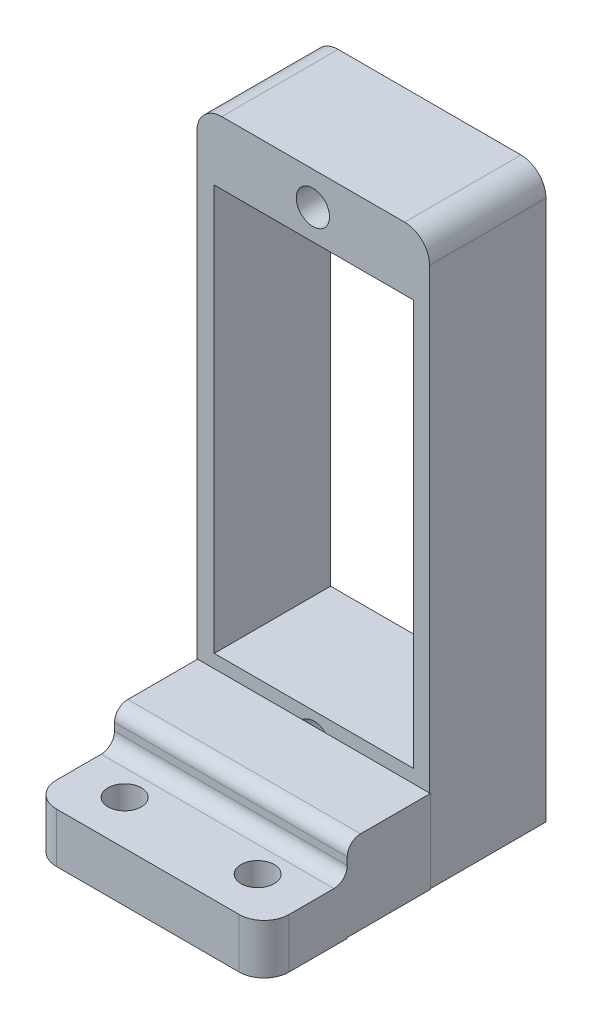
ISO-10303-21;
HEADER;
FILE_DESCRIPTION(('STEP AP214'),'2;1');
FILE_NAME('part.step','',(''),(''),'','','');
FILE_SCHEMA(('AUTOMOTIVE_DESIGN { 1 0 10303 214 1 1 1 1 }'));
ENDSEC;
DATA;
#1=APPLICATION_CONTEXT('core data for automotive mechanical design processes');
#2=APPLICATION_PROTOCOL_DEFINITION('international standard','automotive_design',2000,#1);
#3=PRODUCT_CONTEXT('',#1,'mechanical');
#4=PRODUCT('Part','Part','',(#3));
#5=PRODUCT_RELATED_PRODUCT_CATEGORY('part','',(#4));
#6=PRODUCT_DEFINITION_FORMATION('','',#4);
#7=PRODUCT_DEFINITION_CONTEXT('part definition',#1,'design');
#8=PRODUCT_DEFINITION('design','',#6,#7);
#9=PRODUCT_DEFINITION_SHAPE('','',#8);
#10=(LENGTH_UNIT() NAMED_UNIT(*) SI_UNIT(.MILLI.,.METRE.));
#11=(NAMED_UNIT(*) PLANE_ANGLE_UNIT() SI_UNIT($,.RADIAN.));
#12=(NAMED_UNIT(*) SI_UNIT($,.STERADIAN.) SOLID_ANGLE_UNIT());
#13=UNCERTAINTY_MEASURE_WITH_UNIT(LENGTH_MEASURE(1.E-05),#10,'distance_accuracy_value','');
#14=(GEOMETRIC_REPRESENTATION_CONTEXT(3) GLOBAL_UNCERTAINTY_ASSIGNED_CONTEXT((#13)) GLOBAL_UNIT_ASSIGNED_CONTEXT((#10,
#11,#12)) REPRESENTATION_CONTEXT('',''));
#15=CARTESIAN_POINT('',(0.,0.,0.));
#16=DIRECTION('',(0.,0.,1.));
#17=DIRECTION('',(1.,0.,0.));
#18=AXIS2_PLACEMENT_3D('',#15,#16,#17);
#19=CARTESIAN_POINT('',(231.952994654938,496.99061481828,32.));
#20=DIRECTION('',(1.,0.,0.));
#21=DIRECTION('',(0.,0.,-1.));
#22=AXIS2_PLACEMENT_3D('',#19,#20,#21);
#23=PLANE('',#22);
#24=DIRECTION('',(0.,-1.,0.));
#25=VECTOR('',#24,1.);
#26=CARTESIAN_POINT('',(231.952994654938,496.99061481828,32.));
#27=LINE('',#26,#25);
#28=CARTESIAN_POINT('',(231.952994654938,495.49061481828,32.));
#29=VERTEX_POINT('',#28);
#30=CARTESIAN_POINT('',(231.952994654938,462.99061481828,32.));
#31=VERTEX_POINT('',#30);
#32=EDGE_CURVE('E372',#29,#31,#27,.T.);
#33=ORIENTED_EDGE('',*,*,#32,.F.);
#34=DIRECTION('',(0.,0.,-1.));
#35=VECTOR('',#34,1.);
#36=CARTESIAN_POINT('',(231.952994654938,495.49061481828,32.));
#37=LINE('',#36,#35);
#38=CARTESIAN_POINT('',(231.952994654938,495.49061481828,25.));
#39=VERTEX_POINT('',#38);
#40=EDGE_CURVE('E260',#29,#39,#37,.T.);
#41=ORIENTED_EDGE('',*,*,#40,.T.);
#42=DIRECTION('',(0.,-1.,0.));
#43=VECTOR('',#42,1.);
#44=CARTESIAN_POINT('',(231.952994654938,496.99061481828,25.));
#45=LINE('',#44,#43);
#46=CARTESIAN_POINT('',(231.952994654938,462.99061481828,25.));
#47=VERTEX_POINT('',#46);
#48=EDGE_CURVE('E363',#39,#47,#45,.T.);
#49=ORIENTED_EDGE('',*,*,#48,.T.);
#50=DIRECTION('',(0.,0.,-1.));
#51=VECTOR('',#50,1.);
#52=CARTESIAN_POINT('',(231.952994654938,462.99061481828,32.));
#53=LINE('',#52,#51);
#54=EDGE_CURVE('E233',#31,#47,#53,.T.);
#55=ORIENTED_EDGE('',*,*,#54,.F.);
#56=EDGE_LOOP('',(#33,#41,#49,#55));
#57=FACE_BOUND('',#56,.T.);
#58=ADVANCED_FACE('F36',(#57),#23,.F.);
#59=CARTESIAN_POINT('',(231.952994654938,462.99061481828,32.));
#60=DIRECTION('',(0.,1.,0.));
#61=DIRECTION('',(0.,0.,1.));
#62=AXIS2_PLACEMENT_3D('',#59,#60,#61);
#63=PLANE('',#62);
#64=DIRECTION('',(1.,0.,0.));
#65=VECTOR('',#64,1.);
#66=CARTESIAN_POINT('',(231.952994654938,462.99061481828,25.));
#67=LINE('',#66,#65);
#68=CARTESIAN_POINT('',(245.952994654938,462.99061481828,25.));
#69=VERTEX_POINT('',#68);
#70=EDGE_CURVE('E365',#47,#69,#67,.T.);
#71=ORIENTED_EDGE('',*,*,#70,.T.);
#72=DIRECTION('',(0.,0.,-1.));
#73=VECTOR('',#72,1.);
#74=CARTESIAN_POINT('',(245.952994654938,462.99061481828,32.));
#75=LINE('',#74,#73);
#76=CARTESIAN_POINT('',(245.952994654938,462.99061481828,32.));
#77=VERTEX_POINT('',#76);
#78=EDGE_CURVE('E236',#77,#69,#75,.T.);
#79=ORIENTED_EDGE('',*,*,#78,.F.);
#80=DIRECTION('',(1.,0.,0.));
#81=VECTOR('',#80,1.);
#82=CARTESIAN_POINT('',(231.952994654938,462.99061481828,32.));
#83=LINE('',#82,#81);
#84=EDGE_CURVE('E357',#31,#77,#83,.T.);
#85=ORIENTED_EDGE('',*,*,#84,.F.);
#86=ORIENTED_EDGE('',*,*,#54,.T.);
#87=EDGE_LOOP('',(#71,#79,#85,#86));
#88=FACE_BOUND('',#87,.T.);
#89=ADVANCED_FACE('F477',(#88),#63,.F.);
#90=CARTESIAN_POINT('',(245.952994654938,496.99061481828,32.));
#91=DIRECTION('',(-1.,0.,0.));
#92=DIRECTION('',(0.,0.,1.));
#93=AXIS2_PLACEMENT_3D('',#90,#91,#92);
#94=PLANE('',#93);
#95=DIRECTION('',(0.,1.,0.));
#96=VECTOR('',#95,1.);
#97=CARTESIAN_POINT('',(245.952994654938,496.99061481828,25.));
#98=LINE('',#97,#96);
#99=CARTESIAN_POINT('',(245.952994654938,495.49061481828,25.));
#100=VERTEX_POINT('',#99);
#101=EDGE_CURVE('E368',#69,#100,#98,.T.);
#102=ORIENTED_EDGE('',*,*,#101,.T.);
#103=DIRECTION('',(0.,0.,-1.));
#104=VECTOR('',#103,1.);
#105=CARTESIAN_POINT('',(245.952994654938,495.49061481828,32.));
#106=LINE('',#105,#104);
#107=CARTESIAN_POINT('',(245.952994654938,495.49061481828,32.));
#108=VERTEX_POINT('',#107);
#109=EDGE_CURVE('E276',#100,#108,#106,.F.);
#110=ORIENTED_EDGE('',*,*,#109,.T.);
#111=DIRECTION('',(0.,1.,0.));
#112=VECTOR('',#111,1.);
#113=CARTESIAN_POINT('',(245.952994654938,496.99061481828,32.));
#114=LINE('',#113,#112);
#115=CARTESIAN_POINT('',(245.952994654938,468.,32.));
#116=VERTEX_POINT('',#115);
#117=EDGE_CURVE('E355',#116,#108,#114,.T.);
#118=ORIENTED_EDGE('',*,*,#117,.F.);
#119=CARTESIAN_POINT('',(245.952994654938,463.,32.));
#120=VERTEX_POINT('',#119);
#121=EDGE_CURVE('E351',#120,#116,#114,.T.);
#122=ORIENTED_EDGE('',*,*,#121,.F.);
#123=EDGE_CURVE('E354',#77,#120,#114,.T.);
#124=ORIENTED_EDGE('',*,*,#123,.F.);
#125=ORIENTED_EDGE('',*,*,#78,.T.);
#126=EDGE_LOOP('',(#102,#110,#118,#122,#124,#125));
#127=FACE_BOUND('',#126,.T.);
#128=ADVANCED_FACE('F483',(#127),#94,.F.);
#129=CARTESIAN_POINT('',(231.952994654938,496.99061481828,32.));
#130=DIRECTION('',(0.,-1.,0.));
#131=DIRECTION('',(0.,0.,-1.));
#132=AXIS2_PLACEMENT_3D('',#129,#130,#131);
#133=PLANE('',#132);
#134=DIRECTION('',(-1.,0.,0.));
#135=VECTOR('',#134,1.);
#136=CARTESIAN_POINT('',(231.952994654938,496.99061481828,25.));
#137=LINE('',#136,#135);
#138=CARTESIAN_POINT('',(244.452994654938,496.99061481828,25.));
#139=VERTEX_POINT('',#138);
#140=CARTESIAN_POINT('',(233.452994654938,496.99061481828,25.));
#141=VERTEX_POINT('',#140);
#142=EDGE_CURVE('E370',#139,#141,#137,.T.);
#143=ORIENTED_EDGE('',*,*,#142,.T.);
#144=DIRECTION('',(0.,0.,-1.));
#145=VECTOR('',#144,1.);
#146=CARTESIAN_POINT('',(233.452994654938,496.99061481828,32.));
#147=LINE('',#146,#145);
#148=CARTESIAN_POINT('',(233.452994654938,496.99061481828,32.));
#149=VERTEX_POINT('',#148);
#150=EDGE_CURVE('E270',#141,#149,#147,.F.);
#151=ORIENTED_EDGE('',*,*,#150,.T.);
#152=DIRECTION('',(-1.,0.,0.));
#153=VECTOR('',#152,1.);
#154=CARTESIAN_POINT('',(231.952994654938,496.99061481828,32.));
#155=LINE('',#154,#153);
#156=CARTESIAN_POINT('',(244.452994654938,496.99061481828,32.));
#157=VERTEX_POINT('',#156);
#158=EDGE_CURVE('E242',#157,#149,#155,.T.);
#159=ORIENTED_EDGE('',*,*,#158,.F.);
#160=DIRECTION('',(0.,0.,-1.));
#161=VECTOR('',#160,1.);
#162=CARTESIAN_POINT('',(244.452994654938,496.99061481828,32.));
#163=LINE('',#162,#161);
#164=EDGE_CURVE('E267',#157,#139,#163,.T.);
#165=ORIENTED_EDGE('',*,*,#164,.T.);
#166=EDGE_LOOP('',(#143,#151,#159,#165));
#167=FACE_BOUND('',#166,.T.);
#168=ADVANCED_FACE('F555',(#167),#133,.F.);
#169=CARTESIAN_POINT('',(0.,0.,32.));
#170=DIRECTION('',(0.,0.,1.));
#171=DIRECTION('',(1.,0.,0.));
#172=AXIS2_PLACEMENT_3D('',#169,#170,#171);
#173=PLANE('',#172);
#174=CARTESIAN_POINT('',(238.996354520083,467.272454622162,32.));
#175=DIRECTION('',(0.,0.,-1.));
#176=DIRECTION('',(-1.,0.,0.));
#177=AXIS2_PLACEMENT_3D('',#174,#175,#176);
#178=CIRCLE('',#177,0.999999999999998);
#179=CARTESIAN_POINT('',(238.310294957664,468.,32.));
#180=VERTEX_POINT('',#179);
#181=CARTESIAN_POINT('',(239.682414082501,468.,32.));
#182=VERTEX_POINT('',#181);
#183=EDGE_CURVE('E50',#180,#182,#178,.T.);
#184=ORIENTED_EDGE('',*,*,#183,.T.);
#185=DIRECTION('',(-1.,0.,0.));
#186=VECTOR('',#185,1.);
#187=CARTESIAN_POINT('',(232.,468.,32.));
#188=LINE('',#187,#186);
#189=EDGE_CURVE('E202',#116,#182,#188,.T.);
#190=ORIENTED_EDGE('',*,*,#189,.F.);
#191=ORIENTED_EDGE('',*,*,#117,.T.);
#192=CARTESIAN_POINT('',(244.452994654938,495.49061481828,32.));
#193=DIRECTION('',(0.,0.,1.));
#194=DIRECTION('',(1.,0.,0.));
#195=AXIS2_PLACEMENT_3D('',#192,#193,#194);
#196=CIRCLE('',#195,1.5);
#197=EDGE_CURVE('E272',#108,#157,#196,.T.);
#198=ORIENTED_EDGE('',*,*,#197,.T.);
#199=ORIENTED_EDGE('',*,*,#158,.T.);
#200=CARTESIAN_POINT('',(233.452994654938,495.49061481828,32.));
#201=DIRECTION('',(0.,0.,1.));
#202=DIRECTION('',(1.,0.,0.));
#203=AXIS2_PLACEMENT_3D('',#200,#201,#202);
#204=CIRCLE('',#203,1.5);
#205=EDGE_CURVE('E274',#149,#29,#204,.T.);
#206=ORIENTED_EDGE('',*,*,#205,.T.);
#207=ORIENTED_EDGE('',*,*,#32,.T.);
#208=ORIENTED_EDGE('',*,*,#84,.T.);
#209=ORIENTED_EDGE('',*,*,#123,.T.);
#210=DIRECTION('',(1.,0.,0.));
#211=VECTOR('',#210,1.);
#212=CARTESIAN_POINT('',(232.,463.,32.));
#213=LINE('',#212,#211);
#214=CARTESIAN_POINT('',(232.,463.,32.));
#215=VERTEX_POINT('',#214);
#216=EDGE_CURVE('E232',#215,#120,#213,.T.);
#217=ORIENTED_EDGE('',*,*,#216,.F.);
#218=DIRECTION('',(0.,-1.,0.));
#219=VECTOR('',#218,1.);
#220=CARTESIAN_POINT('',(232.,468.,32.));
#221=LINE('',#220,#219);
#222=CARTESIAN_POINT('',(232.,468.,32.));
#223=VERTEX_POINT('',#222);
#224=EDGE_CURVE('E324',#223,#215,#221,.T.);
#225=ORIENTED_EDGE('',*,*,#224,.F.);
#226=EDGE_CURVE('E203',#180,#223,#188,.T.);
#227=ORIENTED_EDGE('',*,*,#226,.F.);
#228=EDGE_LOOP('',(#184,#190,#191,#198,#199,#206,#207,#208,#209,#217,#225,#227));
#229=FACE_BOUND('',#228,.T.);
#230=DIRECTION('',(0.,-1.,0.));
#231=VECTOR('',#230,1.);
#232=CARTESIAN_POINT('',(233.,493.200012207031,32.));
#233=LINE('',#232,#231);
#234=CARTESIAN_POINT('',(233.,493.200012207031,32.));
#235=VERTEX_POINT('',#234);
#236=CARTESIAN_POINT('',(233.,468.800012207031,32.));
#237=VERTEX_POINT('',#236);
#238=EDGE_CURVE('E384',#235,#237,#233,.T.);
#239=ORIENTED_EDGE('',*,*,#238,.F.);
#240=DIRECTION('',(-1.,0.,0.));
#241=VECTOR('',#240,1.);
#242=CARTESIAN_POINT('',(233.,493.200012207031,32.));
#243=LINE('',#242,#241);
#244=CARTESIAN_POINT('',(245.,493.200012207031,32.));
#245=VERTEX_POINT('',#244);
#246=EDGE_CURVE('E394',#245,#235,#243,.T.);
#247=ORIENTED_EDGE('',*,*,#246,.F.);
#248=DIRECTION('',(0.,1.,0.));
#249=VECTOR('',#248,1.);
#250=CARTESIAN_POINT('',(245.,493.200012207031,32.));
#251=LINE('',#250,#249);
#252=CARTESIAN_POINT('',(245.,468.800012207031,32.));
#253=VERTEX_POINT('',#252);
#254=EDGE_CURVE('E398',#253,#245,#251,.T.);
#255=ORIENTED_EDGE('',*,*,#254,.F.);
#256=DIRECTION('',(1.,0.,0.));
#257=VECTOR('',#256,1.);
#258=CARTESIAN_POINT('',(233.,468.800012207031,32.));
#259=LINE('',#258,#257);
#260=EDGE_CURVE('E401',#237,#253,#259,.T.);
#261=ORIENTED_EDGE('',*,*,#260,.F.);
#262=EDGE_LOOP('',(#239,#247,#255,#261));
#263=FACE_BOUND('',#262,.T.);
#264=CARTESIAN_POINT('',(238.935079191974,495.003072258083,32.));
#265=DIRECTION('',(0.,0.,1.));
#266=DIRECTION('',(1.,0.,0.));
#267=AXIS2_PLACEMENT_3D('',#264,#265,#266);
#268=CIRCLE('',#267,0.999999999999998);
#269=CARTESIAN_POINT('',(239.935079191974,495.003072258083,32.));
#270=VERTEX_POINT('',#269);
#271=EDGE_CURVE('E378',#270,#270,#268,.T.);
#272=ORIENTED_EDGE('',*,*,#271,.F.);
#273=EDGE_LOOP('',(#272));
#274=FACE_BOUND('',#273,.T.);
#275=ADVANCED_FACE('F210',(#229,#263,#274),#173,.T.);
#276=CARTESIAN_POINT('',(0.,0.,25.));
#277=DIRECTION('',(0.,0.,1.));
#278=DIRECTION('',(1.,0.,0.));
#279=AXIS2_PLACEMENT_3D('',#276,#277,#278);
#280=PLANE('',#279);
#281=CARTESIAN_POINT('',(238.996354520083,467.272454622162,25.));
#282=DIRECTION('',(0.,0.,-1.));
#283=DIRECTION('',(-1.,0.,0.));
#284=AXIS2_PLACEMENT_3D('',#281,#282,#283);
#285=CIRCLE('',#284,0.999999999999998);
#286=CARTESIAN_POINT('',(237.996354520083,467.272454622162,25.));
#287=VERTEX_POINT('',#286);
#288=EDGE_CURVE('E207',#287,#287,#285,.T.);
#289=ORIENTED_EDGE('',*,*,#288,.F.);
#290=EDGE_LOOP('',(#289));
#291=FACE_BOUND('',#290,.T.);
#292=DIRECTION('',(-1.,0.,0.));
#293=VECTOR('',#292,1.);
#294=CARTESIAN_POINT('',(233.,493.200012207031,25.));
#295=LINE('',#294,#293);
#296=CARTESIAN_POINT('',(245.,493.200012207031,25.));
#297=VERTEX_POINT('',#296);
#298=CARTESIAN_POINT('',(233.,493.200012207031,25.));
#299=VERTEX_POINT('',#298);
#300=EDGE_CURVE('E389',#297,#299,#295,.T.);
#301=ORIENTED_EDGE('',*,*,#300,.T.);
#302=DIRECTION('',(0.,-1.,0.));
#303=VECTOR('',#302,1.);
#304=CARTESIAN_POINT('',(233.,493.200012207031,25.));
#305=LINE('',#304,#303);
#306=CARTESIAN_POINT('',(233.,468.800012207031,25.));
#307=VERTEX_POINT('',#306);
#308=EDGE_CURVE('E397',#299,#307,#305,.T.);
#309=ORIENTED_EDGE('',*,*,#308,.T.);
#310=DIRECTION('',(1.,0.,0.));
#311=VECTOR('',#310,1.);
#312=CARTESIAN_POINT('',(233.,468.800012207031,25.));
#313=LINE('',#312,#311);
#314=CARTESIAN_POINT('',(245.,468.800012207031,25.));
#315=VERTEX_POINT('',#314);
#316=EDGE_CURVE('E410',#307,#315,#313,.T.);
#317=ORIENTED_EDGE('',*,*,#316,.T.);
#318=DIRECTION('',(0.,1.,0.));
#319=VECTOR('',#318,1.);
#320=CARTESIAN_POINT('',(245.,493.200012207031,25.));
#321=LINE('',#320,#319);
#322=EDGE_CURVE('E407',#315,#297,#321,.T.);
#323=ORIENTED_EDGE('',*,*,#322,.T.);
#324=EDGE_LOOP('',(#301,#309,#317,#323));
#325=FACE_BOUND('',#324,.T.);
#326=CARTESIAN_POINT('',(238.935079191974,495.003072258083,25.));
#327=DIRECTION('',(0.,0.,1.));
#328=DIRECTION('',(1.,0.,0.));
#329=AXIS2_PLACEMENT_3D('',#326,#327,#328);
#330=CIRCLE('',#329,0.999999999999998);
#331=CARTESIAN_POINT('',(239.935079191974,495.003072258083,25.));
#332=VERTEX_POINT('',#331);
#333=EDGE_CURVE('E381',#332,#332,#330,.T.);
#334=ORIENTED_EDGE('',*,*,#333,.T.);
#335=EDGE_LOOP('',(#334));
#336=FACE_BOUND('',#335,.T.);
#337=ORIENTED_EDGE('',*,*,#48,.F.);
#338=CARTESIAN_POINT('',(233.452994654938,495.49061481828,25.));
#339=DIRECTION('',(0.,0.,1.));
#340=DIRECTION('',(1.,0.,0.));
#341=AXIS2_PLACEMENT_3D('',#338,#339,#340);
#342=CIRCLE('',#341,1.5);
#343=EDGE_CURVE('E265',#39,#141,#342,.F.);
#344=ORIENTED_EDGE('',*,*,#343,.T.);
#345=ORIENTED_EDGE('',*,*,#142,.F.);
#346=CARTESIAN_POINT('',(244.452994654938,495.49061481828,25.));
#347=DIRECTION('',(0.,0.,1.));
#348=DIRECTION('',(1.,0.,0.));
#349=AXIS2_PLACEMENT_3D('',#346,#347,#348);
#350=CIRCLE('',#349,1.5);
#351=EDGE_CURVE('E263',#139,#100,#350,.F.);
#352=ORIENTED_EDGE('',*,*,#351,.T.);
#353=ORIENTED_EDGE('',*,*,#101,.F.);
#354=ORIENTED_EDGE('',*,*,#70,.F.);
#355=EDGE_LOOP('',(#337,#344,#345,#352,#353,#354));
#356=FACE_BOUND('',#355,.T.);
#357=ADVANCED_FACE('F551',(#291,#325,#336,#356),#280,.F.);
#358=CARTESIAN_POINT('',(238.935079191974,495.003072258083,25.));
#359=DIRECTION('',(0.,0.,1.));
#360=DIRECTION('',(1.,0.,0.));
#361=AXIS2_PLACEMENT_3D('',#358,#359,#360);
#362=CYLINDRICAL_SURFACE('',#361,0.999999999999998);
#363=CARTESIAN_POINT('',(239.935079191974,495.003072258083,25.));
#364=CARTESIAN_POINT('',(239.935079191974,495.003072258083,25.0729166666667));
#365=CARTESIAN_POINT('',(239.935079191974,495.003072258083,25.1458333333333));
#366=CARTESIAN_POINT('',(239.935079191974,495.003072258083,25.2916666666667));
#367=CARTESIAN_POINT('',(239.935079191974,495.003072258083,25.3645833333333));
#368=CARTESIAN_POINT('',(239.935079191974,495.003072258083,25.5104166666667));
#369=CARTESIAN_POINT('',(239.935079191974,495.003072258083,25.5833333333333));
#370=CARTESIAN_POINT('',(239.935079191974,495.003072258083,25.7291666666667));
#371=CARTESIAN_POINT('',(239.935079191974,495.003072258083,25.8020833333333));
#372=CARTESIAN_POINT('',(239.935079191974,495.003072258083,25.9479166666667));
#373=CARTESIAN_POINT('',(239.935079191974,495.003072258083,26.0208333333333));
#374=CARTESIAN_POINT('',(239.935079191974,495.003072258083,26.1666666666667));
#375=CARTESIAN_POINT('',(239.935079191974,495.003072258083,26.2395833333333));
#376=CARTESIAN_POINT('',(239.935079191974,495.003072258083,26.3854166666667));
#377=CARTESIAN_POINT('',(239.935079191974,495.003072258083,26.4583333333333));
#378=CARTESIAN_POINT('',(239.935079191974,495.003072258083,26.6041666666667));
#379=CARTESIAN_POINT('',(239.935079191974,495.003072258083,26.6770833333333));
#380=CARTESIAN_POINT('',(239.935079191974,495.003072258083,26.8229166666667));
#381=CARTESIAN_POINT('',(239.935079191974,495.003072258083,26.8958333333333));
#382=CARTESIAN_POINT('',(239.935079191974,495.003072258083,27.0416666666667));
#383=CARTESIAN_POINT('',(239.935079191974,495.003072258083,27.1145833333333));
#384=CARTESIAN_POINT('',(239.935079191974,495.003072258083,27.2604166666667));
#385=CARTESIAN_POINT('',(239.935079191974,495.003072258083,27.3333333333333));
#386=CARTESIAN_POINT('',(239.935079191974,495.003072258083,27.4791666666667));
#387=CARTESIAN_POINT('',(239.935079191974,495.003072258083,27.5520833333333));
#388=CARTESIAN_POINT('',(239.935079191974,495.003072258083,27.6979166666667));
#389=CARTESIAN_POINT('',(239.935079191974,495.003072258083,27.7708333333333));
#390=CARTESIAN_POINT('',(239.935079191974,495.003072258083,27.9166666666667));
#391=CARTESIAN_POINT('',(239.935079191974,495.003072258083,27.9895833333333));
#392=CARTESIAN_POINT('',(239.935079191974,495.003072258083,28.1354166666667));
#393=CARTESIAN_POINT('',(239.935079191974,495.003072258083,28.2083333333333));
#394=CARTESIAN_POINT('',(239.935079191974,495.003072258083,28.3541666666667));
#395=CARTESIAN_POINT('',(239.935079191974,495.003072258083,28.4270833333333));
#396=CARTESIAN_POINT('',(239.935079191974,495.003072258083,28.5729166666667));
#397=CARTESIAN_POINT('',(239.935079191974,495.003072258083,28.6458333333333));
#398=CARTESIAN_POINT('',(239.935079191974,495.003072258083,28.7916666666667));
#399=CARTESIAN_POINT('',(239.935079191974,495.003072258083,28.8645833333333));
#400=CARTESIAN_POINT('',(239.935079191974,495.003072258083,29.0104166666667));
#401=CARTESIAN_POINT('',(239.935079191974,495.003072258083,29.0833333333333));
#402=CARTESIAN_POINT('',(239.935079191974,495.003072258083,29.2291666666667));
#403=CARTESIAN_POINT('',(239.935079191974,495.003072258083,29.3020833333333));
#404=CARTESIAN_POINT('',(239.935079191974,495.003072258083,29.4479166666667));
#405=CARTESIAN_POINT('',(239.935079191974,495.003072258083,29.5208333333333));
#406=CARTESIAN_POINT('',(239.935079191974,495.003072258083,29.6666666666667));
#407=CARTESIAN_POINT('',(239.935079191974,495.003072258083,29.7395833333333));
#408=CARTESIAN_POINT('',(239.935079191974,495.003072258083,29.8854166666667));
#409=CARTESIAN_POINT('',(239.935079191974,495.003072258083,29.9583333333333));
#410=CARTESIAN_POINT('',(239.935079191974,495.003072258083,30.1041666666667));
#411=CARTESIAN_POINT('',(239.935079191974,495.003072258083,30.1770833333333));
#412=CARTESIAN_POINT('',(239.935079191974,495.003072258083,30.3229166666667));
#413=CARTESIAN_POINT('',(239.935079191974,495.003072258083,30.3958333333333));
#414=CARTESIAN_POINT('',(239.935079191974,495.003072258083,30.5416666666667));
#415=CARTESIAN_POINT('',(239.935079191974,495.003072258083,30.6145833333333));
#416=CARTESIAN_POINT('',(239.935079191974,495.003072258083,30.7604166666667));
#417=CARTESIAN_POINT('',(239.935079191974,495.003072258083,30.8333333333333));
#418=CARTESIAN_POINT('',(239.935079191974,495.003072258083,30.9791666666667));
#419=CARTESIAN_POINT('',(239.935079191974,495.003072258083,31.0520833333333));
#420=CARTESIAN_POINT('',(239.935079191974,495.003072258083,31.1979166666667));
#421=CARTESIAN_POINT('',(239.935079191974,495.003072258083,31.2708333333333));
#422=CARTESIAN_POINT('',(239.935079191974,495.003072258083,31.4166666666667));
#423=CARTESIAN_POINT('',(239.935079191974,495.003072258083,31.4895833333333));
#424=CARTESIAN_POINT('',(239.935079191974,495.003072258083,31.6354166666667));
#425=CARTESIAN_POINT('',(239.935079191974,495.003072258083,31.7083333333333));
#426=CARTESIAN_POINT('',(239.935079191974,495.003072258083,31.8541666666667));
#427=CARTESIAN_POINT('',(239.935079191974,495.003072258083,31.9270833333333));
#428=CARTESIAN_POINT('',(239.935079191974,495.003072258083,32.));
#429=B_SPLINE_CURVE_WITH_KNOTS('',3,(#363,#364,#365,#366,#367,#368,#369,#370,#371,#372,#373,
#374,#375,#376,#377,#378,#379,#380,#381,#382,#383,#384,#385,#386,#387,#388,#389,#390,#391,#392,
#393,#394,#395,#396,#397,#398,#399,#400,#401,#402,#403,#404,#405,#406,#407,#408,#409,#410,#411,
#412,#413,#414,#415,#416,#417,#418,#419,#420,#421,#422,#423,#424,#425,#426,#427,#428),
.UNSPECIFIED.,.F.,.F.,(4,2,2,2,2,2,2,2,2,2,2,2,2,2,2,2,2,2,2,2,2,2,2,2,2,2,2,2,2,2,2,2,4),(0.,
0.218749999999997,0.437499999999997,0.656249999999997,0.874999999999997,1.09375,1.3125,1.53125,
1.75,1.96875,2.1875,2.40625,2.625,2.84375,3.0625,3.28125,3.5,3.71875,3.9375,4.15625,4.375,
4.59374999999999,4.8125,5.03124999999999,5.24999999999999,5.46874999999999,5.68749999999999,
5.90624999999999,6.12499999999999,6.34375,6.56249999999999,6.78125,6.99999999999999),.UNSPECIFIED.);
#430=EDGE_CURVE('BSEAM547',#332,#270,#429,.T.);
#431=ORIENTED_EDGE('',*,*,#333,.F.);
#432=ORIENTED_EDGE('',*,*,#271,.T.);
#433=ORIENTED_EDGE('',*,*,#430,.T.);
#434=ORIENTED_EDGE('',*,*,#430,.F.);
#435=EDGE_LOOP('',(#431,#433,#432,#434));
#436=FACE_BOUND('',#435,.T.);
#437=ADVANCED_FACE('F547',(#436),#362,.F.);
#438=CARTESIAN_POINT('',(233.,493.200012207031,25.));
#439=DIRECTION('',(-1.,0.,0.));
#440=DIRECTION('',(0.,0.,1.));
#441=AXIS2_PLACEMENT_3D('',#438,#439,#440);
#442=PLANE('',#441);
#443=ORIENTED_EDGE('',*,*,#238,.T.);
#444=DIRECTION('',(0.,0.,1.));
#445=VECTOR('',#444,1.);
#446=CARTESIAN_POINT('',(233.,468.800012207031,25.));
#447=LINE('',#446,#445);
#448=EDGE_CURVE('E385',#307,#237,#447,.T.);
#449=ORIENTED_EDGE('',*,*,#448,.F.);
#450=ORIENTED_EDGE('',*,*,#308,.F.);
#451=DIRECTION('',(0.,0.,1.));
#452=VECTOR('',#451,1.);
#453=CARTESIAN_POINT('',(233.,493.200012207031,25.));
#454=LINE('',#453,#452);
#455=EDGE_CURVE('E366',#299,#235,#454,.T.);
#456=ORIENTED_EDGE('',*,*,#455,.T.);
#457=EDGE_LOOP('',(#443,#449,#450,#456));
#458=FACE_BOUND('',#457,.T.);
#459=ADVANCED_FACE('F537',(#458),#442,.F.);
#460=CARTESIAN_POINT('',(233.,493.200012207031,25.));
#461=DIRECTION('',(0.,1.,0.));
#462=DIRECTION('',(0.,0.,1.));
#463=AXIS2_PLACEMENT_3D('',#460,#461,#462);
#464=PLANE('',#463);
#465=ORIENTED_EDGE('',*,*,#246,.T.);
#466=ORIENTED_EDGE('',*,*,#455,.F.);
#467=ORIENTED_EDGE('',*,*,#300,.F.);
#468=DIRECTION('',(0.,0.,1.));
#469=VECTOR('',#468,1.);
#470=CARTESIAN_POINT('',(245.,493.200012207031,25.));
#471=LINE('',#470,#469);
#472=EDGE_CURVE('E391',#297,#245,#471,.T.);
#473=ORIENTED_EDGE('',*,*,#472,.T.);
#474=EDGE_LOOP('',(#465,#466,#467,#473));
#475=FACE_BOUND('',#474,.T.);
#476=ADVANCED_FACE('F533',(#475),#464,.F.);
#477=CARTESIAN_POINT('',(245.,493.200012207031,25.));
#478=DIRECTION('',(1.,0.,0.));
#479=DIRECTION('',(0.,0.,-1.));
#480=AXIS2_PLACEMENT_3D('',#477,#478,#479);
#481=PLANE('',#480);
#482=ORIENTED_EDGE('',*,*,#254,.T.);
#483=ORIENTED_EDGE('',*,*,#472,.F.);
#484=ORIENTED_EDGE('',*,*,#322,.F.);
#485=DIRECTION('',(0.,0.,1.));
#486=VECTOR('',#485,1.);
#487=CARTESIAN_POINT('',(245.,468.800012207031,25.));
#488=LINE('',#487,#486);
#489=EDGE_CURVE('E388',#315,#253,#488,.T.);
#490=ORIENTED_EDGE('',*,*,#489,.T.);
#491=EDGE_LOOP('',(#482,#483,#484,#490));
#492=FACE_BOUND('',#491,.T.);
#493=ADVANCED_FACE('F536',(#492),#481,.F.);
#494=CARTESIAN_POINT('',(233.,468.800012207031,25.));
#495=DIRECTION('',(0.,-1.,0.));
#496=DIRECTION('',(0.,0.,-1.));
#497=AXIS2_PLACEMENT_3D('',#494,#495,#496);
#498=PLANE('',#497);
#499=ORIENTED_EDGE('',*,*,#260,.T.);
#500=ORIENTED_EDGE('',*,*,#489,.F.);
#501=ORIENTED_EDGE('',*,*,#316,.F.);
#502=ORIENTED_EDGE('',*,*,#448,.T.);
#503=EDGE_LOOP('',(#499,#500,#501,#502));
#504=FACE_BOUND('',#503,.T.);
#505=ADVANCED_FACE('F524',(#504),#498,.F.);
#506=CARTESIAN_POINT('',(0.,0.,32.));
#507=DIRECTION('',(0.,0.,1.));
#508=DIRECTION('',(1.,0.,0.));
#509=AXIS2_PLACEMENT_3D('',#506,#507,#508);
#510=PLANE('',#509);
#511=CARTESIAN_POINT('',(246.,463.,32.));
#512=VERTEX_POINT('',#511);
#513=EDGE_CURVE('E332',#120,#512,#213,.T.);
#514=ORIENTED_EDGE('',*,*,#513,.F.);
#515=ORIENTED_EDGE('',*,*,#121,.T.);
#516=CARTESIAN_POINT('',(246.,468.,32.));
#517=VERTEX_POINT('',#516);
#518=EDGE_CURVE('E219',#517,#116,#188,.T.);
#519=ORIENTED_EDGE('',*,*,#518,.F.);
#520=DIRECTION('',(0.,1.,0.));
#521=VECTOR('',#520,1.);
#522=CARTESIAN_POINT('',(246.,468.,32.));
#523=LINE('',#522,#521);
#524=EDGE_CURVE('E227',#512,#517,#523,.T.);
#525=ORIENTED_EDGE('',*,*,#524,.F.);
#526=EDGE_LOOP('',(#514,#515,#519,#525));
#527=FACE_BOUND('',#526,.T.);
#528=ADVANCED_FACE('F349',(#527),#510,.F.);
#529=CARTESIAN_POINT('',(232.,468.,37.));
#530=DIRECTION('',(1.,0.,0.));
#531=DIRECTION('',(0.,0.,-1.));
#532=AXIS2_PLACEMENT_3D('',#529,#530,#531);
#533=PLANE('',#532);
#534=DIRECTION('',(0.,-1.,0.));
#535=VECTOR('',#534,1.);
#536=CARTESIAN_POINT('',(232.,468.,37.));
#537=LINE('',#536,#535);
#538=CARTESIAN_POINT('',(232.,467.2,37.));
#539=VERTEX_POINT('',#538);
#540=CARTESIAN_POINT('',(232.,466.746662177277,37.));
#541=VERTEX_POINT('',#540);
#542=EDGE_CURVE('E226',#539,#541,#537,.T.);
#543=ORIENTED_EDGE('',*,*,#542,.F.);
#544=CARTESIAN_POINT('',(232.,467.2,36.2));
#545=DIRECTION('',(1.,0.,0.));
#546=DIRECTION('',(0.,0.,-1.));
#547=AXIS2_PLACEMENT_3D('',#544,#545,#546);
#548=CIRCLE('',#547,0.8);
#549=CARTESIAN_POINT('',(232.,468.,36.2));
#550=VERTEX_POINT('',#549);
#551=EDGE_CURVE('E286',#539,#550,#548,.F.);
#552=ORIENTED_EDGE('',*,*,#551,.T.);
#553=DIRECTION('',(0.,0.,-1.));
#554=VECTOR('',#553,1.);
#555=CARTESIAN_POINT('',(232.,468.,37.));
#556=LINE('',#555,#554);
#557=EDGE_CURVE('E329',#550,#223,#556,.T.);
#558=ORIENTED_EDGE('',*,*,#557,.T.);
#559=ORIENTED_EDGE('',*,*,#224,.T.);
#560=DIRECTION('',(0.,0.,-1.));
#561=VECTOR('',#560,1.);
#562=CARTESIAN_POINT('',(232.,463.,37.));
#563=LINE('',#562,#561);
#564=CARTESIAN_POINT('',(232.,463.,37.));
#565=VERTEX_POINT('',#564);
#566=EDGE_CURVE('E346',#565,#215,#563,.T.);
#567=ORIENTED_EDGE('',*,*,#566,.F.);
#568=DIRECTION('',(0.,-1.,0.));
#569=VECTOR('',#568,1.);
#570=CARTESIAN_POINT('',(232.,465.946662177277,37.));
#571=LINE('',#570,#569);
#572=CARTESIAN_POINT('',(232.,462.946662177277,37.));
#573=VERTEX_POINT('',#572);
#574=EDGE_CURVE('E215',#565,#573,#571,.T.);
#575=ORIENTED_EDGE('',*,*,#574,.T.);
#576=DIRECTION('',(0.,0.,-1.));
#577=VECTOR('',#576,1.);
#578=CARTESIAN_POINT('',(232.,462.946662177277,42.));
#579=LINE('',#578,#577);
#580=CARTESIAN_POINT('',(232.,462.946662177277,40.5));
#581=VERTEX_POINT('',#580);
#582=EDGE_CURVE('E318',#581,#573,#579,.T.);
#583=ORIENTED_EDGE('',*,*,#582,.F.);
#584=DIRECTION('',(0.,-1.,0.));
#585=VECTOR('',#584,1.);
#586=CARTESIAN_POINT('',(232.,465.946662177277,40.5));
#587=LINE('',#586,#585);
#588=CARTESIAN_POINT('',(232.,465.946662177277,40.5));
#589=VERTEX_POINT('',#588);
#590=EDGE_CURVE('E252',#581,#589,#587,.F.);
#591=ORIENTED_EDGE('',*,*,#590,.T.);
#592=DIRECTION('',(0.,0.,-1.));
#593=VECTOR('',#592,1.);
#594=CARTESIAN_POINT('',(232.,465.946662177277,42.));
#595=LINE('',#594,#593);
#596=CARTESIAN_POINT('',(232.,465.946662177277,37.8));
#597=VERTEX_POINT('',#596);
#598=EDGE_CURVE('E295',#589,#597,#595,.T.);
#599=ORIENTED_EDGE('',*,*,#598,.T.);
#600=CARTESIAN_POINT('',(232.,466.746662177277,37.8));
#601=DIRECTION('',(1.,0.,0.));
#602=DIRECTION('',(0.,0.,-1.));
#603=AXIS2_PLACEMENT_3D('',#600,#601,#602);
#604=CIRCLE('',#603,0.8);
#605=EDGE_CURVE('E44',#597,#541,#604,.T.);
#606=ORIENTED_EDGE('',*,*,#605,.T.);
#607=EDGE_LOOP('',(#543,#552,#558,#559,#567,#575,#583,#591,#599,#606));
#608=FACE_BOUND('',#607,.T.);
#609=ADVANCED_FACE('F293',(#608),#533,.F.);
#610=CARTESIAN_POINT('',(232.,463.,37.));
#611=DIRECTION('',(0.,1.,0.));
#612=DIRECTION('',(0.,0.,1.));
#613=AXIS2_PLACEMENT_3D('',#610,#611,#612);
#614=PLANE('',#613);
#615=ORIENTED_EDGE('',*,*,#216,.T.);
#616=ORIENTED_EDGE('',*,*,#513,.T.);
#617=DIRECTION('',(0.,0.,-1.));
#618=VECTOR('',#617,1.);
#619=CARTESIAN_POINT('',(246.,463.,37.));
#620=LINE('',#619,#618);
#621=CARTESIAN_POINT('',(246.,463.,37.));
#622=VERTEX_POINT('',#621);
#623=EDGE_CURVE('E339',#622,#512,#620,.T.);
#624=ORIENTED_EDGE('',*,*,#623,.F.);
#625=DIRECTION('',(1.,0.,0.));
#626=VECTOR('',#625,1.);
#627=CARTESIAN_POINT('',(232.,463.,37.));
#628=LINE('',#627,#626);
#629=EDGE_CURVE('E229',#565,#622,#628,.T.);
#630=ORIENTED_EDGE('',*,*,#629,.F.);
#631=ORIENTED_EDGE('',*,*,#566,.T.);
#632=EDGE_LOOP('',(#615,#616,#624,#630,#631));
#633=FACE_BOUND('',#632,.T.);
#634=ADVANCED_FACE('F338',(#633),#614,.F.);
#635=CARTESIAN_POINT('',(246.,468.,37.));
#636=DIRECTION('',(-1.,0.,0.));
#637=DIRECTION('',(0.,0.,1.));
#638=AXIS2_PLACEMENT_3D('',#635,#636,#637);
#639=PLANE('',#638);
#640=DIRECTION('',(0.,0.,-1.));
#641=VECTOR('',#640,1.);
#642=CARTESIAN_POINT('',(246.,468.,37.));
#643=LINE('',#642,#641);
#644=CARTESIAN_POINT('',(246.,468.,36.2));
#645=VERTEX_POINT('',#644);
#646=EDGE_CURVE('E347',#645,#517,#643,.T.);
#647=ORIENTED_EDGE('',*,*,#646,.F.);
#648=CARTESIAN_POINT('',(246.,467.2,36.2));
#649=DIRECTION('',(-1.,0.,0.));
#650=DIRECTION('',(0.,0.,1.));
#651=AXIS2_PLACEMENT_3D('',#648,#649,#650);
#652=CIRCLE('',#651,0.8);
#653=CARTESIAN_POINT('',(246.,467.2,37.));
#654=VERTEX_POINT('',#653);
#655=EDGE_CURVE('E289',#645,#654,#652,.F.);
#656=ORIENTED_EDGE('',*,*,#655,.T.);
#657=DIRECTION('',(0.,1.,0.));
#658=VECTOR('',#657,1.);
#659=CARTESIAN_POINT('',(246.,468.,37.));
#660=LINE('',#659,#658);
#661=CARTESIAN_POINT('',(246.,466.746662177277,37.));
#662=VERTEX_POINT('',#661);
#663=EDGE_CURVE('E312',#662,#654,#660,.T.);
#664=ORIENTED_EDGE('',*,*,#663,.F.);
#665=CARTESIAN_POINT('',(246.,466.746662177277,37.8));
#666=DIRECTION('',(-1.,0.,0.));
#667=DIRECTION('',(0.,0.,1.));
#668=AXIS2_PLACEMENT_3D('',#665,#666,#667);
#669=CIRCLE('',#668,0.8);
#670=CARTESIAN_POINT('',(246.,465.946662177277,37.8));
#671=VERTEX_POINT('',#670);
#672=EDGE_CURVE('E11',#662,#671,#669,.T.);
#673=ORIENTED_EDGE('',*,*,#672,.T.);
#674=DIRECTION('',(0.,0.,-1.));
#675=VECTOR('',#674,1.);
#676=CARTESIAN_POINT('',(246.,465.946662177277,42.));
#677=LINE('',#676,#675);
#678=CARTESIAN_POINT('',(246.,465.946662177277,40.5));
#679=VERTEX_POINT('',#678);
#680=EDGE_CURVE('E310',#679,#671,#677,.T.);
#681=ORIENTED_EDGE('',*,*,#680,.F.);
#682=DIRECTION('',(0.,1.,0.));
#683=VECTOR('',#682,1.);
#684=CARTESIAN_POINT('',(246.,462.946662177277,40.5));
#685=LINE('',#684,#683);
#686=CARTESIAN_POINT('',(246.,462.946662177277,40.5));
#687=VERTEX_POINT('',#686);
#688=EDGE_CURVE('E258',#679,#687,#685,.F.);
#689=ORIENTED_EDGE('',*,*,#688,.T.);
#690=DIRECTION('',(0.,0.,-1.));
#691=VECTOR('',#690,1.);
#692=CARTESIAN_POINT('',(246.,462.946662177277,42.));
#693=LINE('',#692,#691);
#694=CARTESIAN_POINT('',(246.,462.946662177277,37.));
#695=VERTEX_POINT('',#694);
#696=EDGE_CURVE('E316',#687,#695,#693,.T.);
#697=ORIENTED_EDGE('',*,*,#696,.T.);
#698=DIRECTION('',(0.,1.,0.));
#699=VECTOR('',#698,1.);
#700=CARTESIAN_POINT('',(246.,465.946662177277,37.));
#701=LINE('',#700,#699);
#702=EDGE_CURVE('E345',#695,#622,#701,.T.);
#703=ORIENTED_EDGE('',*,*,#702,.T.);
#704=ORIENTED_EDGE('',*,*,#623,.T.);
#705=ORIENTED_EDGE('',*,*,#524,.T.);
#706=EDGE_LOOP('',(#647,#656,#664,#673,#681,#689,#697,#703,#704,#705));
#707=FACE_BOUND('',#706,.T.);
#708=ADVANCED_FACE('F309',(#707),#639,.F.);
#709=CARTESIAN_POINT('',(232.,468.,37.));
#710=DIRECTION('',(0.,-1.,0.));
#711=DIRECTION('',(0.,0.,-1.));
#712=AXIS2_PLACEMENT_3D('',#709,#710,#711);
#713=PLANE('',#712);
#714=ORIENTED_EDGE('',*,*,#557,.F.);
#715=DIRECTION('',(-1.,0.,0.));
#716=VECTOR('',#715,1.);
#717=CARTESIAN_POINT('',(246.,468.,36.2));
#718=LINE('',#717,#716);
#719=EDGE_CURVE('E58',#550,#645,#718,.F.);
#720=ORIENTED_EDGE('',*,*,#719,.T.);
#721=ORIENTED_EDGE('',*,*,#646,.T.);
#722=ORIENTED_EDGE('',*,*,#518,.T.);
#723=ORIENTED_EDGE('',*,*,#189,.T.);
#724=EDGE_CURVE('E197',#182,#180,#188,.T.);
#725=ORIENTED_EDGE('',*,*,#724,.T.);
#726=ORIENTED_EDGE('',*,*,#226,.T.);
#727=EDGE_LOOP('',(#714,#720,#721,#722,#723,#725,#726));
#728=FACE_BOUND('',#727,.T.);
#729=ADVANCED_FACE('F217',(#728),#713,.F.);
#730=CARTESIAN_POINT('',(0.,0.,37.));
#731=DIRECTION('',(0.,0.,1.));
#732=DIRECTION('',(1.,0.,0.));
#733=AXIS2_PLACEMENT_3D('',#730,#731,#732);
#734=PLANE('',#733);
#735=ORIENTED_EDGE('',*,*,#542,.T.);
#736=DIRECTION('',(-1.,0.,0.));
#737=VECTOR('',#736,1.);
#738=CARTESIAN_POINT('',(0.,466.746662177277,37.));
#739=LINE('',#738,#737);
#740=EDGE_CURVE('E284',#541,#662,#739,.F.);
#741=ORIENTED_EDGE('',*,*,#740,.T.);
#742=ORIENTED_EDGE('',*,*,#663,.T.);
#743=DIRECTION('',(-1.,0.,0.));
#744=VECTOR('',#743,1.);
#745=CARTESIAN_POINT('',(232.,467.2,37.));
#746=LINE('',#745,#744);
#747=EDGE_CURVE('E281',#654,#539,#746,.T.);
#748=ORIENTED_EDGE('',*,*,#747,.T.);
#749=EDGE_LOOP('',(#735,#741,#742,#748));
#750=FACE_BOUND('',#749,.T.);
#751=ADVANCED_FACE('F300',(#750),#734,.T.);
#752=CARTESIAN_POINT('',(0.,0.,37.));
#753=DIRECTION('',(0.,0.,1.));
#754=DIRECTION('',(1.,0.,0.));
#755=AXIS2_PLACEMENT_3D('',#752,#753,#754);
#756=PLANE('',#755);
#757=ORIENTED_EDGE('',*,*,#574,.F.);
#758=ORIENTED_EDGE('',*,*,#629,.T.);
#759=ORIENTED_EDGE('',*,*,#702,.F.);
#760=DIRECTION('',(1.,0.,0.));
#761=VECTOR('',#760,1.);
#762=CARTESIAN_POINT('',(232.,462.946662177277,37.));
#763=LINE('',#762,#761);
#764=EDGE_CURVE('E424',#573,#695,#763,.T.);
#765=ORIENTED_EDGE('',*,*,#764,.F.);
#766=EDGE_LOOP('',(#757,#758,#759,#765));
#767=FACE_BOUND('',#766,.T.);
#768=ADVANCED_FACE('F422',(#767),#756,.F.);
#769=CARTESIAN_POINT('',(232.,462.946662177277,42.));
#770=DIRECTION('',(0.,1.,0.));
#771=DIRECTION('',(0.,0.,1.));
#772=AXIS2_PLACEMENT_3D('',#769,#770,#771);
#773=PLANE('',#772);
#774=CARTESIAN_POINT('',(234.951502539022,462.946662177277,39.3412252333563));
#775=DIRECTION('',(0.,1.,0.));
#776=DIRECTION('',(0.,0.,1.));
#777=AXIS2_PLACEMENT_3D('',#774,#775,#776);
#778=CIRCLE('',#777,0.999999999999998);
#779=CARTESIAN_POINT('',(234.951502539022,462.946662177277,40.3412252333563));
#780=VERTEX_POINT('',#779);
#781=EDGE_CURVE('E437',#780,#780,#778,.T.);
#782=ORIENTED_EDGE('',*,*,#781,.T.);
#783=EDGE_LOOP('',(#782));
#784=FACE_BOUND('',#783,.T.);
#785=CARTESIAN_POINT('',(242.951502539022,462.946662177277,39.3412252333563));
#786=DIRECTION('',(0.,1.,0.));
#787=DIRECTION('',(0.,0.,1.));
#788=AXIS2_PLACEMENT_3D('',#785,#786,#787);
#789=CIRCLE('',#788,0.999999999999998);
#790=CARTESIAN_POINT('',(242.951502539022,462.946662177277,40.3412252333563));
#791=VERTEX_POINT('',#790);
#792=EDGE_CURVE('E442',#791,#791,#789,.T.);
#793=ORIENTED_EDGE('',*,*,#792,.T.);
#794=EDGE_LOOP('',(#793));
#795=FACE_BOUND('',#794,.T.);
#796=DIRECTION('',(1.,0.,0.));
#797=VECTOR('',#796,1.);
#798=CARTESIAN_POINT('',(232.,462.946662177277,42.));
#799=LINE('',#798,#797);
#800=CARTESIAN_POINT('',(233.5,462.946662177277,42.));
#801=VERTEX_POINT('',#800);
#802=CARTESIAN_POINT('',(244.5,462.946662177277,42.));
#803=VERTEX_POINT('',#802);
#804=EDGE_CURVE('E429',#801,#803,#799,.T.);
#805=ORIENTED_EDGE('',*,*,#804,.F.);
#806=CARTESIAN_POINT('',(233.5,462.946662177277,40.5));
#807=DIRECTION('',(0.,1.,0.));
#808=DIRECTION('',(0.,0.,1.));
#809=AXIS2_PLACEMENT_3D('',#806,#807,#808);
#810=CIRCLE('',#809,1.5);
#811=EDGE_CURVE('E250',#801,#581,#810,.F.);
#812=ORIENTED_EDGE('',*,*,#811,.T.);
#813=ORIENTED_EDGE('',*,*,#582,.T.);
#814=ORIENTED_EDGE('',*,*,#764,.T.);
#815=ORIENTED_EDGE('',*,*,#696,.F.);
#816=CARTESIAN_POINT('',(244.5,462.946662177277,40.5));
#817=DIRECTION('',(0.,1.,0.));
#818=DIRECTION('',(0.,0.,1.));
#819=AXIS2_PLACEMENT_3D('',#816,#817,#818);
#820=CIRCLE('',#819,1.5);
#821=EDGE_CURVE('E248',#687,#803,#820,.F.);
#822=ORIENTED_EDGE('',*,*,#821,.T.);
#823=EDGE_LOOP('',(#805,#812,#813,#814,#815,#822));
#824=FACE_BOUND('',#823,.T.);
#825=ADVANCED_FACE('F451',(#784,#795,#824),#773,.F.);
#826=CARTESIAN_POINT('',(232.,465.946662177277,42.));
#827=DIRECTION('',(0.,-1.,0.));
#828=DIRECTION('',(0.,0.,-1.));
#829=AXIS2_PLACEMENT_3D('',#826,#827,#828);
#830=PLANE('',#829);
#831=CARTESIAN_POINT('',(234.951502539022,465.946662177277,39.3412252333563));
#832=DIRECTION('',(0.,1.,0.));
#833=DIRECTION('',(0.,0.,1.));
#834=AXIS2_PLACEMENT_3D('',#831,#832,#833);
#835=CIRCLE('',#834,0.999999999999998);
#836=CARTESIAN_POINT('',(234.951502539022,465.946662177277,40.3412252333563));
#837=VERTEX_POINT('',#836);
#838=EDGE_CURVE('E445',#837,#837,#835,.T.);
#839=ORIENTED_EDGE('',*,*,#838,.F.);
#840=EDGE_LOOP('',(#839));
#841=FACE_BOUND('',#840,.T.);
#842=CARTESIAN_POINT('',(242.951502539022,465.946662177277,39.3412252333563));
#843=DIRECTION('',(0.,1.,0.));
#844=DIRECTION('',(0.,0.,1.));
#845=AXIS2_PLACEMENT_3D('',#842,#843,#844);
#846=CIRCLE('',#845,0.999999999999998);
#847=CARTESIAN_POINT('',(242.951502539022,465.946662177277,40.3412252333563));
#848=VERTEX_POINT('',#847);
#849=EDGE_CURVE('E439',#848,#848,#846,.T.);
#850=ORIENTED_EDGE('',*,*,#849,.F.);
#851=EDGE_LOOP('',(#850));
#852=FACE_BOUND('',#851,.T.);
#853=ORIENTED_EDGE('',*,*,#680,.T.);
#854=DIRECTION('',(-1.,0.,0.));
#855=VECTOR('',#854,1.);
#856=CARTESIAN_POINT('',(232.,465.946662177277,37.8));
#857=LINE('',#856,#855);
#858=EDGE_CURVE('E278',#671,#597,#857,.T.);
#859=ORIENTED_EDGE('',*,*,#858,.T.);
#860=ORIENTED_EDGE('',*,*,#598,.F.);
#861=CARTESIAN_POINT('',(233.5,465.946662177277,40.5));
#862=DIRECTION('',(0.,-1.,0.));
#863=DIRECTION('',(0.,0.,-1.));
#864=AXIS2_PLACEMENT_3D('',#861,#862,#863);
#865=CIRCLE('',#864,1.5);
#866=CARTESIAN_POINT('',(233.5,465.946662177277,42.));
#867=VERTEX_POINT('',#866);
#868=EDGE_CURVE('E256',#589,#867,#865,.F.);
#869=ORIENTED_EDGE('',*,*,#868,.T.);
#870=DIRECTION('',(-1.,0.,0.));
#871=VECTOR('',#870,1.);
#872=CARTESIAN_POINT('',(232.,465.946662177277,42.));
#873=LINE('',#872,#871);
#874=CARTESIAN_POINT('',(244.5,465.946662177277,42.));
#875=VERTEX_POINT('',#874);
#876=EDGE_CURVE('E320',#875,#867,#873,.T.);
#877=ORIENTED_EDGE('',*,*,#876,.F.);
#878=CARTESIAN_POINT('',(244.5,465.946662177277,40.5));
#879=DIRECTION('',(0.,-1.,0.));
#880=DIRECTION('',(0.,0.,-1.));
#881=AXIS2_PLACEMENT_3D('',#878,#879,#880);
#882=CIRCLE('',#881,1.5);
#883=EDGE_CURVE('E254',#875,#679,#882,.F.);
#884=ORIENTED_EDGE('',*,*,#883,.T.);
#885=EDGE_LOOP('',(#853,#859,#860,#869,#877,#884));
#886=FACE_BOUND('',#885,.T.);
#887=ADVANCED_FACE('F314',(#841,#852,#886),#830,.F.);
#888=CARTESIAN_POINT('',(0.,0.,42.));
#889=DIRECTION('',(0.,0.,1.));
#890=DIRECTION('',(1.,0.,0.));
#891=AXIS2_PLACEMENT_3D('',#888,#889,#890);
#892=PLANE('',#891);
#893=ORIENTED_EDGE('',*,*,#876,.T.);
#894=DIRECTION('',(0.,-1.,0.));
#895=VECTOR('',#894,1.);
#896=CARTESIAN_POINT('',(233.5,462.946662177277,42.));
#897=LINE('',#896,#895);
#898=EDGE_CURVE('E222',#867,#801,#897,.T.);
#899=ORIENTED_EDGE('',*,*,#898,.T.);
#900=ORIENTED_EDGE('',*,*,#804,.T.);
#901=DIRECTION('',(0.,1.,0.));
#902=VECTOR('',#901,1.);
#903=CARTESIAN_POINT('',(244.5,465.946662177277,42.));
#904=LINE('',#903,#902);
#905=EDGE_CURVE('E220',#803,#875,#904,.T.);
#906=ORIENTED_EDGE('',*,*,#905,.T.);
#907=EDGE_LOOP('',(#893,#899,#900,#906));
#908=FACE_BOUND('',#907,.T.);
#909=ADVANCED_FACE('F463',(#908),#892,.T.);
#910=CARTESIAN_POINT('',(233.5,0.,40.5));
#911=DIRECTION('',(0.,1.,0.));
#912=DIRECTION('',(0.,0.,1.));
#913=AXIS2_PLACEMENT_3D('',#910,#911,#912);
#914=CYLINDRICAL_SURFACE('',#913,1.5);
#915=ORIENTED_EDGE('',*,*,#868,.F.);
#916=ORIENTED_EDGE('',*,*,#590,.F.);
#917=ORIENTED_EDGE('',*,*,#811,.F.);
#918=ORIENTED_EDGE('',*,*,#898,.F.);
#919=EDGE_LOOP('',(#915,#916,#917,#918));
#920=FACE_BOUND('',#919,.T.);
#921=ADVANCED_FACE('F487',(#920),#914,.T.);
#922=CARTESIAN_POINT('',(244.5,0.,40.5));
#923=DIRECTION('',(0.,-1.,0.));
#924=DIRECTION('',(0.,0.,-1.));
#925=AXIS2_PLACEMENT_3D('',#922,#923,#924);
#926=CYLINDRICAL_SURFACE('',#925,1.5);
#927=ORIENTED_EDGE('',*,*,#821,.F.);
#928=ORIENTED_EDGE('',*,*,#688,.F.);
#929=ORIENTED_EDGE('',*,*,#883,.F.);
#930=ORIENTED_EDGE('',*,*,#905,.F.);
#931=EDGE_LOOP('',(#927,#928,#929,#930));
#932=FACE_BOUND('',#931,.T.);
#933=ADVANCED_FACE('F490',(#932),#926,.T.);
#934=CARTESIAN_POINT('',(233.452994654938,495.49061481828,32.));
#935=DIRECTION('',(0.,0.,-1.));
#936=DIRECTION('',(-1.,0.,0.));
#937=AXIS2_PLACEMENT_3D('',#934,#935,#936);
#938=CYLINDRICAL_SURFACE('',#937,1.5);
#939=ORIENTED_EDGE('',*,*,#205,.F.);
#940=ORIENTED_EDGE('',*,*,#150,.F.);
#941=ORIENTED_EDGE('',*,*,#343,.F.);
#942=ORIENTED_EDGE('',*,*,#40,.F.);
#943=EDGE_LOOP('',(#939,#940,#941,#942));
#944=FACE_BOUND('',#943,.T.);
#945=ADVANCED_FACE('F494',(#944),#938,.T.);
#946=CARTESIAN_POINT('',(244.452994654938,495.49061481828,32.));
#947=DIRECTION('',(0.,0.,-1.));
#948=DIRECTION('',(-1.,0.,0.));
#949=AXIS2_PLACEMENT_3D('',#946,#947,#948);
#950=CYLINDRICAL_SURFACE('',#949,1.5);
#951=ORIENTED_EDGE('',*,*,#197,.F.);
#952=ORIENTED_EDGE('',*,*,#109,.F.);
#953=ORIENTED_EDGE('',*,*,#351,.F.);
#954=ORIENTED_EDGE('',*,*,#164,.F.);
#955=EDGE_LOOP('',(#951,#952,#953,#954));
#956=FACE_BOUND('',#955,.T.);
#957=ADVANCED_FACE('F498',(#956),#950,.T.);
#958=CARTESIAN_POINT('',(232.,466.746662177277,37.8));
#959=DIRECTION('',(-1.,0.,0.));
#960=DIRECTION('',(0.,0.,1.));
#961=AXIS2_PLACEMENT_3D('',#958,#959,#960);
#962=CYLINDRICAL_SURFACE('',#961,0.8);
#963=ORIENTED_EDGE('',*,*,#672,.F.);
#964=ORIENTED_EDGE('',*,*,#740,.F.);
#965=ORIENTED_EDGE('',*,*,#605,.F.);
#966=ORIENTED_EDGE('',*,*,#858,.F.);
#967=EDGE_LOOP('',(#963,#964,#965,#966));
#968=FACE_BOUND('',#967,.T.);
#969=ADVANCED_FACE('F305',(#968),#962,.F.);
#970=CARTESIAN_POINT('',(0.,467.2,36.2));
#971=DIRECTION('',(1.,0.,0.));
#972=DIRECTION('',(0.,0.,-1.));
#973=AXIS2_PLACEMENT_3D('',#970,#971,#972);
#974=CYLINDRICAL_SURFACE('',#973,0.8);
#975=ORIENTED_EDGE('',*,*,#655,.F.);
#976=ORIENTED_EDGE('',*,*,#719,.F.);
#977=ORIENTED_EDGE('',*,*,#551,.F.);
#978=ORIENTED_EDGE('',*,*,#747,.F.);
#979=EDGE_LOOP('',(#975,#976,#977,#978));
#980=FACE_BOUND('',#979,.T.);
#981=ADVANCED_FACE('F38',(#980),#974,.T.);
#982=CARTESIAN_POINT('',(238.996354520083,467.272454622162,32.));
#983=DIRECTION('',(0.,0.,-1.));
#984=DIRECTION('',(-1.,0.,0.));
#985=AXIS2_PLACEMENT_3D('',#982,#983,#984);
#986=PLANE('',#985);
#987=ORIENTED_EDGE('',*,*,#724,.F.);
#988=EDGE_CURVE('E199',#182,#180,#178,.T.);
#989=ORIENTED_EDGE('',*,*,#988,.T.);
#990=EDGE_LOOP('',(#987,#989));
#991=FACE_BOUND('',#990,.T.);
#992=ADVANCED_FACE('F198',(#991),#986,.T.);
#993=CARTESIAN_POINT('',(238.996354520083,467.272454622162,32.));
#994=DIRECTION('',(0.,0.,-1.));
#995=DIRECTION('',(-1.,0.,0.));
#996=AXIS2_PLACEMENT_3D('',#993,#994,#995);
#997=CYLINDRICAL_SURFACE('',#996,0.999999999999998);
#998=ORIENTED_EDGE('',*,*,#183,.F.);
#999=ORIENTED_EDGE('',*,*,#988,.F.);
#1000=EDGE_LOOP('',(#998,#999));
#1001=FACE_BOUND('',#1000,.T.);
#1002=ORIENTED_EDGE('',*,*,#288,.T.);
#1003=EDGE_LOOP('',(#1002));
#1004=FACE_BOUND('',#1003,.T.);
#1005=ADVANCED_FACE('F205',(#1001,#1004),#997,.F.);
#1006=CARTESIAN_POINT('',(242.951502539022,462.946662177277,39.3412252333563));
#1007=DIRECTION('',(0.,1.,0.));
#1008=DIRECTION('',(0.,0.,1.));
#1009=AXIS2_PLACEMENT_3D('',#1006,#1007,#1008);
#1010=CYLINDRICAL_SURFACE('',#1009,0.999999999999998);
#1011=ORIENTED_EDGE('',*,*,#792,.F.);
#1012=EDGE_LOOP('',(#1011));
#1013=FACE_BOUND('',#1012,.T.);
#1014=ORIENTED_EDGE('',*,*,#849,.T.);
#1015=EDGE_LOOP('',(#1014));
#1016=FACE_BOUND('',#1015,.T.);
#1017=ADVANCED_FACE('F457',(#1013,#1016),#1010,.F.);
#1018=CARTESIAN_POINT('',(234.951502539022,462.946662177277,39.3412252333563));
#1019=DIRECTION('',(0.,1.,0.));
#1020=DIRECTION('',(0.,0.,1.));
#1021=AXIS2_PLACEMENT_3D('',#1018,#1019,#1020);
#1022=CYLINDRICAL_SURFACE('',#1021,0.999999999999998);
#1023=ORIENTED_EDGE('',*,*,#781,.F.);
#1024=EDGE_LOOP('',(#1023));
#1025=FACE_BOUND('',#1024,.T.);
#1026=ORIENTED_EDGE('',*,*,#838,.T.);
#1027=EDGE_LOOP('',(#1026));
#1028=FACE_BOUND('',#1027,.T.);
#1029=ADVANCED_FACE('F454',(#1025,#1028),#1022,.F.);
#1030=CLOSED_SHELL('',(#58,#89,#128,#168,#275,#357,#437,#459,#476,#493,#505,#528,#609,#634,#708,
#729,#751,#768,#825,#887,#909,#921,#933,#945,#957,#969,#981,#992,#1005,#1017,#1029));
#1031=MANIFOLD_SOLID_BREP('B2',#1030);
#1032=ADVANCED_BREP_SHAPE_REPRESENTATION('',(#18,#1031),#14);
#1033=SHAPE_DEFINITION_REPRESENTATION(#9,#1032);
ENDSEC;
END-ISO-10303-21;
